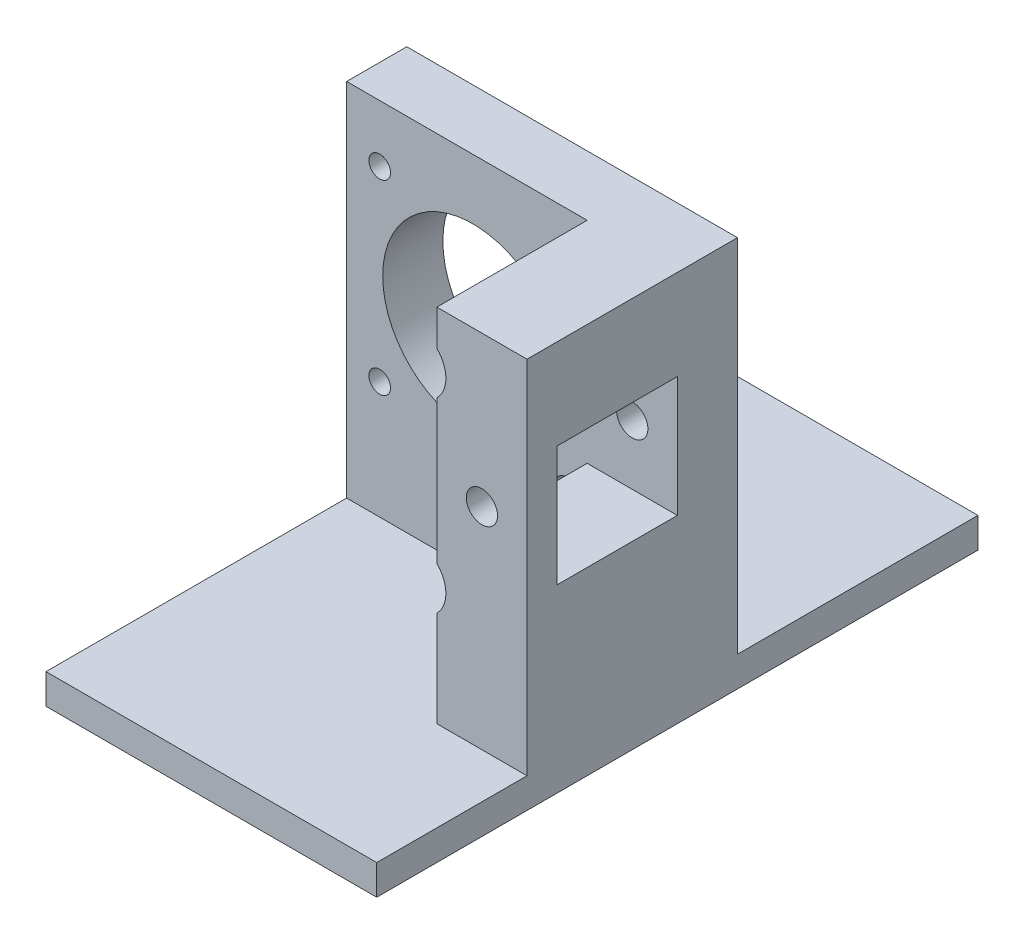
ISO-10303-21;
HEADER;
FILE_DESCRIPTION(('STEP AP214'),'2;1');
FILE_NAME('part.step','',(''),(''),'','','');
FILE_SCHEMA(('AUTOMOTIVE_DESIGN { 1 0 10303 214 1 1 1 1 }'));
ENDSEC;
DATA;
#1=APPLICATION_CONTEXT('core data for automotive mechanical design processes');
#2=APPLICATION_PROTOCOL_DEFINITION('international standard','automotive_design',2000,#1);
#3=PRODUCT_CONTEXT('',#1,'mechanical');
#4=PRODUCT('Part','Part','',(#3));
#5=PRODUCT_RELATED_PRODUCT_CATEGORY('part','',(#4));
#6=PRODUCT_DEFINITION_FORMATION('','',#4);
#7=PRODUCT_DEFINITION_CONTEXT('part definition',#1,'design');
#8=PRODUCT_DEFINITION('design','',#6,#7);
#9=PRODUCT_DEFINITION_SHAPE('','',#8);
#10=(LENGTH_UNIT() NAMED_UNIT(*) SI_UNIT(.MILLI.,.METRE.));
#11=(NAMED_UNIT(*) PLANE_ANGLE_UNIT() SI_UNIT($,.RADIAN.));
#12=(NAMED_UNIT(*) SI_UNIT($,.STERADIAN.) SOLID_ANGLE_UNIT());
#13=UNCERTAINTY_MEASURE_WITH_UNIT(LENGTH_MEASURE(1.E-05),#10,'distance_accuracy_value','');
#14=(GEOMETRIC_REPRESENTATION_CONTEXT(3) GLOBAL_UNCERTAINTY_ASSIGNED_CONTEXT((#13)) GLOBAL_UNIT_ASSIGNED_CONTEXT((#10,
#11,#12)) REPRESENTATION_CONTEXT('',''));
#15=CARTESIAN_POINT('',(0.,0.,0.));
#16=DIRECTION('',(0.,0.,1.));
#17=DIRECTION('',(1.,0.,0.));
#18=AXIS2_PLACEMENT_3D('',#15,#16,#17);
#19=CARTESIAN_POINT('',(30.,55.,0.));
#20=DIRECTION('',(-1.,0.,0.));
#21=DIRECTION('',(0.,0.,1.));
#22=AXIS2_PLACEMENT_3D('',#19,#20,#21);
#23=PLANE('',#22);
#24=DIRECTION('',(0.,0.,1.));
#25=VECTOR('',#24,1.);
#26=CARTESIAN_POINT('',(30.,20.9297201676013,-64.142135623731));
#27=LINE('',#26,#25);
#28=CARTESIAN_POINT('',(30.,20.9297201676013,-50.));
#29=VERTEX_POINT('',#28);
#30=CARTESIAN_POINT('',(30.,20.9297201676013,-25.));
#31=VERTEX_POINT('',#30);
#32=EDGE_CURVE('E90',#29,#31,#27,.T.);
#33=ORIENTED_EDGE('',*,*,#32,.F.);
#34=DIRECTION('',(0.,-1.,0.));
#35=VECTOR('',#34,1.);
#36=CARTESIAN_POINT('',(30.,55.,-50.));
#37=LINE('',#36,#35);
#38=CARTESIAN_POINT('',(30.,5.,-50.));
#39=VERTEX_POINT('',#38);
#40=EDGE_CURVE('E351',#29,#39,#37,.T.);
#41=ORIENTED_EDGE('',*,*,#40,.T.);
#42=DIRECTION('',(0.,0.,-1.));
#43=VECTOR('',#42,1.);
#44=CARTESIAN_POINT('',(30.,5.,0.));
#45=LINE('',#44,#43);
#46=CARTESIAN_POINT('',(30.,5.,-25.));
#47=VERTEX_POINT('',#46);
#48=EDGE_CURVE('E412',#47,#39,#45,.T.);
#49=ORIENTED_EDGE('',*,*,#48,.F.);
#50=DIRECTION('',(0.,-1.,0.));
#51=VECTOR('',#50,1.);
#52=CARTESIAN_POINT('',(30.,55.,-25.));
#53=LINE('',#52,#51);
#54=EDGE_CURVE('E407',#31,#47,#53,.T.);
#55=ORIENTED_EDGE('',*,*,#54,.F.);
#56=EDGE_LOOP('',(#33,#41,#49,#55));
#57=FACE_BOUND('',#56,.T.);
#58=ADVANCED_FACE('F73',(#57),#23,.T.);
#59=DIRECTION('',(0.,0.,1.));
#60=VECTOR('',#59,1.);
#61=CARTESIAN_POINT('',(30.,28.0707185451804,-64.142135623731));
#62=LINE('',#61,#60);
#63=CARTESIAN_POINT('',(30.,28.0707185451804,-25.));
#64=VERTEX_POINT('',#63);
#65=CARTESIAN_POINT('',(30.,28.0707185451804,-50.));
#66=VERTEX_POINT('',#65);
#67=EDGE_CURVE('E311',#64,#66,#62,.F.);
#68=ORIENTED_EDGE('',*,*,#67,.F.);
#69=CARTESIAN_POINT('',(30.,51.9292814548196,-25.));
#70=VERTEX_POINT('',#69);
#71=EDGE_CURVE('E413',#70,#64,#53,.T.);
#72=ORIENTED_EDGE('',*,*,#71,.F.);
#73=DIRECTION('',(0.,0.,1.));
#74=VECTOR('',#73,1.);
#75=CARTESIAN_POINT('',(30.,51.9292814548196,-64.142135623731));
#76=LINE('',#75,#74);
#77=CARTESIAN_POINT('',(30.,51.9292814548196,-50.));
#78=VERTEX_POINT('',#77);
#79=EDGE_CURVE('E97',#78,#70,#76,.T.);
#80=ORIENTED_EDGE('',*,*,#79,.F.);
#81=CARTESIAN_POINT('',(30.,50.,-50.));
#82=VERTEX_POINT('',#81);
#83=EDGE_CURVE('E360',#78,#82,#37,.T.);
#84=ORIENTED_EDGE('',*,*,#83,.T.);
#85=DIRECTION('',(0.,0.,-1.));
#86=VECTOR('',#85,1.);
#87=CARTESIAN_POINT('',(30.,50.,-3.07417596432748));
#88=LINE('',#87,#86);
#89=CARTESIAN_POINT('',(30.,50.,-30.));
#90=VERTEX_POINT('',#89);
#91=EDGE_CURVE('E396',#90,#82,#88,.T.);
#92=ORIENTED_EDGE('',*,*,#91,.F.);
#93=DIRECTION('',(0.,-1.,0.));
#94=VECTOR('',#93,1.);
#95=CARTESIAN_POINT('',(30.,55.,-30.));
#96=LINE('',#95,#94);
#97=CARTESIAN_POINT('',(30.,30.,-30.));
#98=VERTEX_POINT('',#97);
#99=EDGE_CURVE('E208',#90,#98,#96,.T.);
#100=ORIENTED_EDGE('',*,*,#99,.T.);
#101=DIRECTION('',(0.,0.,-1.));
#102=VECTOR('',#101,1.);
#103=CARTESIAN_POINT('',(30.,30.,-3.07417596432748));
#104=LINE('',#103,#102);
#105=CARTESIAN_POINT('',(30.,30.,-50.));
#106=VERTEX_POINT('',#105);
#107=EDGE_CURVE('E389',#98,#106,#104,.T.);
#108=ORIENTED_EDGE('',*,*,#107,.T.);
#109=EDGE_CURVE('E361',#106,#66,#37,.T.);
#110=ORIENTED_EDGE('',*,*,#109,.T.);
#111=EDGE_LOOP('',(#68,#72,#80,#84,#92,#100,#108,#110));
#112=FACE_BOUND('',#111,.T.);
#113=ADVANCED_FACE('F432',(#112),#23,.T.);
#114=CARTESIAN_POINT('',(0.,5.,0.));
#115=DIRECTION('',(0.,-1.,0.));
#116=DIRECTION('',(0.,0.,-1.));
#117=AXIS2_PLACEMENT_3D('',#114,#115,#116);
#118=PLANE('',#117);
#119=DIRECTION('',(0.,0.,-1.));
#120=VECTOR('',#119,1.);
#121=CARTESIAN_POINT('',(-10.,5.,0.));
#122=LINE('',#121,#120);
#123=CARTESIAN_POINT('',(-10.,5.,-60.));
#124=VERTEX_POINT('',#123);
#125=CARTESIAN_POINT('',(-10.,5.,-100.));
#126=VERTEX_POINT('',#125);
#127=EDGE_CURVE('E377',#124,#126,#122,.T.);
#128=ORIENTED_EDGE('',*,*,#127,.F.);
#129=DIRECTION('',(-1.,0.,0.));
#130=VECTOR('',#129,1.);
#131=CARTESIAN_POINT('',(40.,5.,-60.));
#132=LINE('',#131,#130);
#133=CARTESIAN_POINT('',(45.,5.,-60.));
#134=VERTEX_POINT('',#133);
#135=EDGE_CURVE('E289',#134,#124,#132,.T.);
#136=ORIENTED_EDGE('',*,*,#135,.F.);
#137=DIRECTION('',(0.,0.,1.));
#138=VECTOR('',#137,1.);
#139=CARTESIAN_POINT('',(45.,5.,-100.));
#140=LINE('',#139,#138);
#141=CARTESIAN_POINT('',(45.,5.,-100.));
#142=VERTEX_POINT('',#141);
#143=EDGE_CURVE('E241',#142,#134,#140,.T.);
#144=ORIENTED_EDGE('',*,*,#143,.F.);
#145=DIRECTION('',(1.,0.,0.));
#146=VECTOR('',#145,1.);
#147=CARTESIAN_POINT('',(0.,5.,-100.));
#148=LINE('',#147,#146);
#149=EDGE_CURVE('E385',#126,#142,#148,.T.);
#150=ORIENTED_EDGE('',*,*,#149,.F.);
#151=EDGE_LOOP('',(#128,#136,#144,#150));
#152=FACE_BOUND('',#151,.T.);
#153=ADVANCED_FACE('F504',(#152),#118,.F.);
#154=CARTESIAN_POINT('',(0.,55.,-50.));
#155=DIRECTION('',(0.,0.,1.));
#156=DIRECTION('',(1.,0.,0.));
#157=AXIS2_PLACEMENT_3D('',#154,#155,#156);
#158=PLANE('',#157);
#159=CARTESIAN_POINT('',(37.5,40.,-50.));
#160=DIRECTION('',(0.,0.,1.));
#161=DIRECTION('',(1.,0.,0.));
#162=AXIS2_PLACEMENT_3D('',#159,#160,#161);
#163=CIRCLE('',#162,2.6);
#164=CARTESIAN_POINT('',(40.1,40.,-50.));
#165=VERTEX_POINT('',#164);
#166=EDGE_CURVE('E223',#165,#165,#163,.T.);
#167=ORIENTED_EDGE('',*,*,#166,.F.);
#168=EDGE_LOOP('',(#167));
#169=FACE_BOUND('',#168,.T.);
#170=ORIENTED_EDGE('',*,*,#40,.F.);
#171=CARTESIAN_POINT('',(26.4997806436091,24.5002193563909,-50.));
#172=DIRECTION('',(0.,0.,1.));
#173=DIRECTION('',(1.,0.,0.));
#174=AXIS2_PLACEMENT_3D('',#171,#172,#173);
#175=CIRCLE('',#174,5.);
#176=EDGE_CURVE('E301',#66,#29,#175,.F.);
#177=ORIENTED_EDGE('',*,*,#176,.F.);
#178=ORIENTED_EDGE('',*,*,#109,.F.);
#179=DIRECTION('',(1.,0.,0.));
#180=VECTOR('',#179,1.);
#181=CARTESIAN_POINT('',(30.,30.,-50.));
#182=LINE('',#181,#180);
#183=CARTESIAN_POINT('',(45.,30.,-50.));
#184=VERTEX_POINT('',#183);
#185=EDGE_CURVE('E388',#106,#184,#182,.T.);
#186=ORIENTED_EDGE('',*,*,#185,.T.);
#187=DIRECTION('',(0.,1.,0.));
#188=VECTOR('',#187,1.);
#189=CARTESIAN_POINT('',(45.,50.,-50.));
#190=LINE('',#189,#188);
#191=CARTESIAN_POINT('',(45.,50.,-50.));
#192=VERTEX_POINT('',#191);
#193=EDGE_CURVE('E231',#184,#192,#190,.T.);
#194=ORIENTED_EDGE('',*,*,#193,.T.);
#195=DIRECTION('',(1.,0.,0.));
#196=VECTOR('',#195,1.);
#197=CARTESIAN_POINT('',(30.,50.,-50.));
#198=LINE('',#197,#196);
#199=EDGE_CURVE('E213',#82,#192,#198,.T.);
#200=ORIENTED_EDGE('',*,*,#199,.F.);
#201=ORIENTED_EDGE('',*,*,#83,.F.);
#202=CARTESIAN_POINT('',(26.4997806436091,55.4997806436091,-50.));
#203=DIRECTION('',(0.,0.,1.));
#204=DIRECTION('',(1.,0.,0.));
#205=AXIS2_PLACEMENT_3D('',#202,#203,#204);
#206=CIRCLE('',#205,5.);
#207=CARTESIAN_POINT('',(30.,59.0702798323987,-50.));
#208=VERTEX_POINT('',#207);
#209=EDGE_CURVE('E300',#208,#78,#206,.F.);
#210=ORIENTED_EDGE('',*,*,#209,.F.);
#211=CARTESIAN_POINT('',(30.,65.,-50.));
#212=VERTEX_POINT('',#211);
#213=EDGE_CURVE('E356',#212,#208,#37,.T.);
#214=ORIENTED_EDGE('',*,*,#213,.F.);
#215=DIRECTION('',(1.,0.,0.));
#216=VECTOR('',#215,1.);
#217=CARTESIAN_POINT('',(-10.,65.,-50.));
#218=LINE('',#217,#216);
#219=CARTESIAN_POINT('',(-10.,65.,-50.));
#220=VERTEX_POINT('',#219);
#221=EDGE_CURVE('E340',#220,#212,#218,.T.);
#222=ORIENTED_EDGE('',*,*,#221,.F.);
#223=DIRECTION('',(0.,-1.,0.));
#224=VECTOR('',#223,1.);
#225=CARTESIAN_POINT('',(-10.,55.,-50.));
#226=LINE('',#225,#224);
#227=CARTESIAN_POINT('',(-10.,5.,-50.));
#228=VERTEX_POINT('',#227);
#229=EDGE_CURVE('E352',#220,#228,#226,.T.);
#230=ORIENTED_EDGE('',*,*,#229,.T.);
#231=DIRECTION('',(1.,0.,0.));
#232=VECTOR('',#231,1.);
#233=CARTESIAN_POINT('',(-10.,5.,-50.));
#234=LINE('',#233,#232);
#235=EDGE_CURVE('E355',#228,#39,#234,.T.);
#236=ORIENTED_EDGE('',*,*,#235,.T.);
#237=EDGE_LOOP('',(#170,#177,#178,#186,#194,#200,#201,#210,#214,#222,#230,#236));
#238=FACE_BOUND('',#237,.T.);
#239=CARTESIAN_POINT('',(-4.49978064360913,24.5002193563909,-50.));
#240=DIRECTION('',(0.,0.,1.));
#241=DIRECTION('',(1.,0.,0.));
#242=AXIS2_PLACEMENT_3D('',#239,#240,#241);
#243=CIRCLE('',#242,1.8);
#244=CARTESIAN_POINT('',(-2.69978064360913,24.5002193563909,-50.));
#245=VERTEX_POINT('',#244);
#246=EDGE_CURVE('E326',#245,#245,#243,.T.);
#247=ORIENTED_EDGE('',*,*,#246,.F.);
#248=EDGE_LOOP('',(#247));
#249=FACE_BOUND('',#248,.T.);
#250=CARTESIAN_POINT('',(-4.49978064360913,55.4997806436091,-50.));
#251=DIRECTION('',(0.,0.,1.));
#252=DIRECTION('',(1.,0.,0.));
#253=AXIS2_PLACEMENT_3D('',#250,#251,#252);
#254=CIRCLE('',#253,1.8);
#255=CARTESIAN_POINT('',(-2.69978064360913,55.4997806436091,-50.));
#256=VERTEX_POINT('',#255);
#257=EDGE_CURVE('E317',#256,#256,#254,.T.);
#258=ORIENTED_EDGE('',*,*,#257,.F.);
#259=EDGE_LOOP('',(#258));
#260=FACE_BOUND('',#259,.T.);
#261=CARTESIAN_POINT('',(11.,40.,-50.));
#262=DIRECTION('',(0.,0.,1.));
#263=DIRECTION('',(1.,0.,0.));
#264=AXIS2_PLACEMENT_3D('',#261,#262,#263);
#265=CIRCLE('',#264,15.);
#266=CARTESIAN_POINT('',(26.,40.,-50.));
#267=VERTEX_POINT('',#266);
#268=EDGE_CURVE('E321',#267,#267,#265,.T.);
#269=ORIENTED_EDGE('',*,*,#268,.F.);
#270=EDGE_LOOP('',(#269));
#271=FACE_BOUND('',#270,.T.);
#272=CARTESIAN_POINT('',(26.4997806436091,55.4997806436091,-50.));
#273=DIRECTION('',(0.,0.,1.));
#274=DIRECTION('',(1.,0.,0.));
#275=AXIS2_PLACEMENT_3D('',#272,#273,#274);
#276=CIRCLE('',#275,1.8);
#277=CARTESIAN_POINT('',(28.2997806436091,55.4997806436091,-50.));
#278=VERTEX_POINT('',#277);
#279=EDGE_CURVE('E322',#278,#278,#276,.T.);
#280=ORIENTED_EDGE('',*,*,#279,.F.);
#281=EDGE_LOOP('',(#280));
#282=FACE_BOUND('',#281,.T.);
#283=CARTESIAN_POINT('',(26.4997806436091,24.5002193563909,-50.));
#284=DIRECTION('',(0.,0.,1.));
#285=DIRECTION('',(1.,0.,0.));
#286=AXIS2_PLACEMENT_3D('',#283,#284,#285);
#287=CIRCLE('',#286,1.8);
#288=CARTESIAN_POINT('',(28.2997806436091,24.5002193563909,-50.));
#289=VERTEX_POINT('',#288);
#290=EDGE_CURVE('E316',#289,#289,#287,.T.);
#291=ORIENTED_EDGE('',*,*,#290,.F.);
#292=EDGE_LOOP('',(#291));
#293=FACE_BOUND('',#292,.T.);
#294=ADVANCED_FACE('F481',(#169,#238,#249,#260,#271,#282,#293),#158,.T.);
#295=CARTESIAN_POINT('',(0.,55.,-30.));
#296=DIRECTION('',(0.,0.,1.));
#297=DIRECTION('',(1.,0.,0.));
#298=AXIS2_PLACEMENT_3D('',#295,#296,#297);
#299=PLANE('',#298);
#300=CARTESIAN_POINT('',(37.5,40.,-30.));
#301=DIRECTION('',(0.,0.,1.));
#302=DIRECTION('',(1.,0.,0.));
#303=AXIS2_PLACEMENT_3D('',#300,#301,#302);
#304=CIRCLE('',#303,2.6);
#305=CARTESIAN_POINT('',(40.1,40.,-30.));
#306=VERTEX_POINT('',#305);
#307=EDGE_CURVE('E819',#306,#306,#304,.T.);
#308=ORIENTED_EDGE('',*,*,#307,.T.);
#309=EDGE_LOOP('',(#308));
#310=FACE_BOUND('',#309,.T.);
#311=DIRECTION('',(1.,0.,0.));
#312=VECTOR('',#311,1.);
#313=CARTESIAN_POINT('',(30.,50.,-30.));
#314=LINE('',#313,#312);
#315=CARTESIAN_POINT('',(45.,50.,-30.));
#316=VERTEX_POINT('',#315);
#317=EDGE_CURVE('E200',#90,#316,#314,.T.);
#318=ORIENTED_EDGE('',*,*,#317,.T.);
#319=DIRECTION('',(0.,-1.,0.));
#320=VECTOR('',#319,1.);
#321=CARTESIAN_POINT('',(45.,50.,-30.));
#322=LINE('',#321,#320);
#323=CARTESIAN_POINT('',(45.,30.,-30.));
#324=VERTEX_POINT('',#323);
#325=EDGE_CURVE('E205',#316,#324,#322,.T.);
#326=ORIENTED_EDGE('',*,*,#325,.T.);
#327=DIRECTION('',(1.,0.,0.));
#328=VECTOR('',#327,1.);
#329=CARTESIAN_POINT('',(30.,30.,-30.));
#330=LINE('',#329,#328);
#331=EDGE_CURVE('E393',#98,#324,#330,.T.);
#332=ORIENTED_EDGE('',*,*,#331,.F.);
#333=ORIENTED_EDGE('',*,*,#99,.F.);
#334=EDGE_LOOP('',(#318,#326,#332,#333));
#335=FACE_BOUND('',#334,.T.);
#336=ADVANCED_FACE('F202',(#310,#335),#299,.F.);
#337=ORIENTED_EDGE('',*,*,#48,.T.);
#338=ORIENTED_EDGE('',*,*,#235,.F.);
#339=CARTESIAN_POINT('',(-10.,5.,0.));
#340=VERTEX_POINT('',#339);
#341=EDGE_CURVE('E378',#340,#228,#122,.T.);
#342=ORIENTED_EDGE('',*,*,#341,.F.);
#343=DIRECTION('',(1.,0.,0.));
#344=VECTOR('',#343,1.);
#345=CARTESIAN_POINT('',(0.,5.,0.));
#346=LINE('',#345,#344);
#347=CARTESIAN_POINT('',(45.,5.,0.));
#348=VERTEX_POINT('',#347);
#349=EDGE_CURVE('E418',#340,#348,#346,.T.);
#350=ORIENTED_EDGE('',*,*,#349,.T.);
#351=DIRECTION('',(0.,0.,1.));
#352=VECTOR('',#351,1.);
#353=CARTESIAN_POINT('',(45.,5.,-25.));
#354=LINE('',#353,#352);
#355=CARTESIAN_POINT('',(45.,5.,-25.));
#356=VERTEX_POINT('',#355);
#357=EDGE_CURVE('E257',#356,#348,#354,.T.);
#358=ORIENTED_EDGE('',*,*,#357,.F.);
#359=DIRECTION('',(1.,0.,0.));
#360=VECTOR('',#359,1.);
#361=CARTESIAN_POINT('',(0.,5.,-25.));
#362=LINE('',#361,#360);
#363=EDGE_CURVE('E212',#47,#356,#362,.T.);
#364=ORIENTED_EDGE('',*,*,#363,.F.);
#365=EDGE_LOOP('',(#337,#338,#342,#350,#358,#364));
#366=FACE_BOUND('',#365,.T.);
#367=ADVANCED_FACE('F446',(#366),#118,.F.);
#368=CARTESIAN_POINT('',(0.,5.,0.));
#369=DIRECTION('',(0.,0.,-1.));
#370=DIRECTION('',(-1.,0.,0.));
#371=AXIS2_PLACEMENT_3D('',#368,#369,#370);
#372=PLANE('',#371);
#373=DIRECTION('',(1.,0.,0.));
#374=VECTOR('',#373,1.);
#375=CARTESIAN_POINT('',(0.,0.,0.));
#376=LINE('',#375,#374);
#377=CARTESIAN_POINT('',(-10.,0.,0.));
#378=VERTEX_POINT('',#377);
#379=CARTESIAN_POINT('',(45.,0.,0.));
#380=VERTEX_POINT('',#379);
#381=EDGE_CURVE('E417',#378,#380,#376,.T.);
#382=ORIENTED_EDGE('',*,*,#381,.T.);
#383=DIRECTION('',(0.,-1.,0.));
#384=VECTOR('',#383,1.);
#385=CARTESIAN_POINT('',(45.,5.,0.));
#386=LINE('',#385,#384);
#387=EDGE_CURVE('E261',#348,#380,#386,.T.);
#388=ORIENTED_EDGE('',*,*,#387,.F.);
#389=ORIENTED_EDGE('',*,*,#349,.F.);
#390=DIRECTION('',(0.,1.,0.));
#391=VECTOR('',#390,1.);
#392=CARTESIAN_POINT('',(-10.,0.,0.));
#393=LINE('',#392,#391);
#394=EDGE_CURVE('E373',#378,#340,#393,.T.);
#395=ORIENTED_EDGE('',*,*,#394,.F.);
#396=EDGE_LOOP('',(#382,#388,#389,#395));
#397=FACE_BOUND('',#396,.T.);
#398=ADVANCED_FACE('F75',(#397),#372,.F.);
#399=CARTESIAN_POINT('',(0.,0.,0.));
#400=DIRECTION('',(0.,-1.,0.));
#401=DIRECTION('',(0.,0.,-1.));
#402=AXIS2_PLACEMENT_3D('',#399,#400,#401);
#403=PLANE('',#402);
#404=ORIENTED_EDGE('',*,*,#381,.F.);
#405=DIRECTION('',(0.,0.,1.));
#406=VECTOR('',#405,1.);
#407=CARTESIAN_POINT('',(-10.,0.,-100.));
#408=LINE('',#407,#406);
#409=CARTESIAN_POINT('',(-10.,0.,-100.));
#410=VERTEX_POINT('',#409);
#411=EDGE_CURVE('E369',#410,#378,#408,.T.);
#412=ORIENTED_EDGE('',*,*,#411,.F.);
#413=DIRECTION('',(-1.,0.,0.));
#414=VECTOR('',#413,1.);
#415=CARTESIAN_POINT('',(40.,0.,-100.));
#416=LINE('',#415,#414);
#417=CARTESIAN_POINT('',(45.,0.,-100.));
#418=VERTEX_POINT('',#417);
#419=EDGE_CURVE('E382',#418,#410,#416,.T.);
#420=ORIENTED_EDGE('',*,*,#419,.F.);
#421=DIRECTION('',(0.,0.,-1.));
#422=VECTOR('',#421,1.);
#423=CARTESIAN_POINT('',(45.,0.,0.));
#424=LINE('',#423,#422);
#425=EDGE_CURVE('E265',#380,#418,#424,.T.);
#426=ORIENTED_EDGE('',*,*,#425,.F.);
#427=EDGE_LOOP('',(#404,#412,#420,#426));
#428=FACE_BOUND('',#427,.T.);
#429=ADVANCED_FACE('F455',(#428),#403,.T.);
#430=DIRECTION('',(0.,0.,1.));
#431=VECTOR('',#430,1.);
#432=CARTESIAN_POINT('',(30.,59.0702798323987,-64.142135623731));
#433=LINE('',#432,#431);
#434=CARTESIAN_POINT('',(30.,59.0702798323987,-25.));
#435=VERTEX_POINT('',#434);
#436=EDGE_CURVE('E304',#435,#208,#433,.F.);
#437=ORIENTED_EDGE('',*,*,#436,.F.);
#438=CARTESIAN_POINT('',(30.,65.,-25.));
#439=VERTEX_POINT('',#438);
#440=EDGE_CURVE('E408',#439,#435,#53,.T.);
#441=ORIENTED_EDGE('',*,*,#440,.F.);
#442=DIRECTION('',(0.,0.,1.));
#443=VECTOR('',#442,1.);
#444=CARTESIAN_POINT('',(30.,65.,-50.));
#445=LINE('',#444,#443);
#446=EDGE_CURVE('E344',#212,#439,#445,.T.);
#447=ORIENTED_EDGE('',*,*,#446,.F.);
#448=ORIENTED_EDGE('',*,*,#213,.T.);
#449=EDGE_LOOP('',(#437,#441,#447,#448));
#450=FACE_BOUND('',#449,.T.);
#451=ADVANCED_FACE('F477',(#450),#23,.T.);
#452=CARTESIAN_POINT('',(0.,55.,-25.));
#453=DIRECTION('',(0.,0.,-1.));
#454=DIRECTION('',(-1.,0.,0.));
#455=AXIS2_PLACEMENT_3D('',#452,#453,#454);
#456=PLANE('',#455);
#457=CARTESIAN_POINT('',(37.5,40.,-25.));
#458=DIRECTION('',(0.,0.,-1.));
#459=DIRECTION('',(-1.,0.,0.));
#460=AXIS2_PLACEMENT_3D('',#457,#458,#459);
#461=CIRCLE('',#460,2.6);
#462=CARTESIAN_POINT('',(34.9,40.,-25.));
#463=VERTEX_POINT('',#462);
#464=EDGE_CURVE('E816',#463,#463,#461,.T.);
#465=ORIENTED_EDGE('',*,*,#464,.T.);
#466=EDGE_LOOP('',(#465));
#467=FACE_BOUND('',#466,.T.);
#468=ORIENTED_EDGE('',*,*,#71,.T.);
#469=CARTESIAN_POINT('',(26.4997806436091,24.5002193563909,-25.));
#470=DIRECTION('',(0.,0.,-1.));
#471=DIRECTION('',(-1.,0.,0.));
#472=AXIS2_PLACEMENT_3D('',#469,#470,#471);
#473=CIRCLE('',#472,5.);
#474=EDGE_CURVE('E12',#64,#31,#473,.T.);
#475=ORIENTED_EDGE('',*,*,#474,.T.);
#476=ORIENTED_EDGE('',*,*,#54,.T.);
#477=ORIENTED_EDGE('',*,*,#363,.T.);
#478=DIRECTION('',(0.,-1.,0.));
#479=VECTOR('',#478,1.);
#480=CARTESIAN_POINT('',(45.,65.,-25.));
#481=LINE('',#480,#479);
#482=CARTESIAN_POINT('',(45.,65.,-25.));
#483=VERTEX_POINT('',#482);
#484=EDGE_CURVE('E253',#483,#356,#481,.T.);
#485=ORIENTED_EDGE('',*,*,#484,.F.);
#486=DIRECTION('',(1.,0.,0.));
#487=VECTOR('',#486,1.);
#488=CARTESIAN_POINT('',(30.,65.,-25.));
#489=LINE('',#488,#487);
#490=EDGE_CURVE('E348',#439,#483,#489,.T.);
#491=ORIENTED_EDGE('',*,*,#490,.F.);
#492=ORIENTED_EDGE('',*,*,#440,.T.);
#493=CARTESIAN_POINT('',(26.4997806436091,55.4997806436091,-25.));
#494=DIRECTION('',(0.,0.,-1.));
#495=DIRECTION('',(-1.,0.,0.));
#496=AXIS2_PLACEMENT_3D('',#493,#494,#495);
#497=CIRCLE('',#496,5.);
#498=EDGE_CURVE('E83',#435,#70,#497,.T.);
#499=ORIENTED_EDGE('',*,*,#498,.T.);
#500=EDGE_LOOP('',(#468,#475,#476,#477,#485,#491,#492,#499));
#501=FACE_BOUND('',#500,.T.);
#502=ADVANCED_FACE('F427',(#467,#501),#456,.F.);
#503=CARTESIAN_POINT('',(30.,50.,-3.07417596432748));
#504=DIRECTION('',(0.,1.,0.));
#505=DIRECTION('',(0.,0.,1.));
#506=AXIS2_PLACEMENT_3D('',#503,#504,#505);
#507=PLANE('',#506);
#508=ORIENTED_EDGE('',*,*,#317,.F.);
#509=ORIENTED_EDGE('',*,*,#91,.T.);
#510=ORIENTED_EDGE('',*,*,#199,.T.);
#511=DIRECTION('',(0.,0.,1.));
#512=VECTOR('',#511,1.);
#513=CARTESIAN_POINT('',(45.,50.,-30.));
#514=LINE('',#513,#512);
#515=EDGE_CURVE('E216',#192,#316,#514,.T.);
#516=ORIENTED_EDGE('',*,*,#515,.T.);
#517=EDGE_LOOP('',(#508,#509,#510,#516));
#518=FACE_BOUND('',#517,.T.);
#519=ADVANCED_FACE('F217',(#518),#507,.F.);
#520=CARTESIAN_POINT('',(30.,30.,-3.07417596432748));
#521=DIRECTION('',(0.,1.,0.));
#522=DIRECTION('',(0.,0.,1.));
#523=AXIS2_PLACEMENT_3D('',#520,#521,#522);
#524=PLANE('',#523);
#525=ORIENTED_EDGE('',*,*,#107,.F.);
#526=ORIENTED_EDGE('',*,*,#331,.T.);
#527=DIRECTION('',(0.,0.,-1.));
#528=VECTOR('',#527,1.);
#529=CARTESIAN_POINT('',(45.,30.,-30.));
#530=LINE('',#529,#528);
#531=EDGE_CURVE('E227',#324,#184,#530,.T.);
#532=ORIENTED_EDGE('',*,*,#531,.T.);
#533=ORIENTED_EDGE('',*,*,#185,.F.);
#534=EDGE_LOOP('',(#525,#526,#532,#533));
#535=FACE_BOUND('',#534,.T.);
#536=ADVANCED_FACE('F536',(#535),#524,.T.);
#537=CARTESIAN_POINT('',(0.,0.,-100.));
#538=DIRECTION('',(0.,0.,-1.));
#539=DIRECTION('',(-1.,0.,0.));
#540=AXIS2_PLACEMENT_3D('',#537,#538,#539);
#541=PLANE('',#540);
#542=ORIENTED_EDGE('',*,*,#149,.T.);
#543=DIRECTION('',(0.,1.,0.));
#544=VECTOR('',#543,1.);
#545=CARTESIAN_POINT('',(45.,0.,-100.));
#546=LINE('',#545,#544);
#547=EDGE_CURVE('E237',#418,#142,#546,.T.);
#548=ORIENTED_EDGE('',*,*,#547,.F.);
#549=ORIENTED_EDGE('',*,*,#419,.T.);
#550=DIRECTION('',(0.,-1.,0.));
#551=VECTOR('',#550,1.);
#552=CARTESIAN_POINT('',(-10.,5.,-100.));
#553=LINE('',#552,#551);
#554=EDGE_CURVE('E365',#126,#410,#553,.T.);
#555=ORIENTED_EDGE('',*,*,#554,.F.);
#556=EDGE_LOOP('',(#542,#548,#549,#555));
#557=FACE_BOUND('',#556,.T.);
#558=ADVANCED_FACE('F462',(#557),#541,.T.);
#559=CARTESIAN_POINT('',(-10.,0.,0.));
#560=DIRECTION('',(-1.,0.,0.));
#561=DIRECTION('',(0.,0.,1.));
#562=AXIS2_PLACEMENT_3D('',#559,#560,#561);
#563=PLANE('',#562);
#564=ORIENTED_EDGE('',*,*,#554,.T.);
#565=ORIENTED_EDGE('',*,*,#411,.T.);
#566=ORIENTED_EDGE('',*,*,#394,.T.);
#567=ORIENTED_EDGE('',*,*,#341,.T.);
#568=ORIENTED_EDGE('',*,*,#229,.F.);
#569=DIRECTION('',(0.,0.,1.));
#570=VECTOR('',#569,1.);
#571=CARTESIAN_POINT('',(-10.,65.,-55.));
#572=LINE('',#571,#570);
#573=CARTESIAN_POINT('',(-10.,65.,-60.));
#574=VERTEX_POINT('',#573);
#575=EDGE_CURVE('E336',#574,#220,#572,.T.);
#576=ORIENTED_EDGE('',*,*,#575,.F.);
#577=DIRECTION('',(0.,1.,0.));
#578=VECTOR('',#577,1.);
#579=CARTESIAN_POINT('',(-10.,5.,-60.));
#580=LINE('',#579,#578);
#581=EDGE_CURVE('E293',#124,#574,#580,.T.);
#582=ORIENTED_EDGE('',*,*,#581,.F.);
#583=ORIENTED_EDGE('',*,*,#127,.T.);
#584=EDGE_LOOP('',(#564,#565,#566,#567,#568,#576,#582,#583));
#585=FACE_BOUND('',#584,.T.);
#586=ADVANCED_FACE('F457',(#585),#563,.T.);
#587=CARTESIAN_POINT('',(0.,65.,0.));
#588=DIRECTION('',(0.,1.,0.));
#589=DIRECTION('',(0.,0.,1.));
#590=AXIS2_PLACEMENT_3D('',#587,#588,#589);
#591=PLANE('',#590);
#592=ORIENTED_EDGE('',*,*,#490,.T.);
#593=DIRECTION('',(0.,0.,1.));
#594=VECTOR('',#593,1.);
#595=CARTESIAN_POINT('',(45.,65.,-60.));
#596=LINE('',#595,#594);
#597=CARTESIAN_POINT('',(45.,65.,-60.));
#598=VERTEX_POINT('',#597);
#599=EDGE_CURVE('E249',#598,#483,#596,.T.);
#600=ORIENTED_EDGE('',*,*,#599,.F.);
#601=DIRECTION('',(1.,0.,0.));
#602=VECTOR('',#601,1.);
#603=CARTESIAN_POINT('',(-10.,65.,-60.));
#604=LINE('',#603,#602);
#605=EDGE_CURVE('E297',#574,#598,#604,.T.);
#606=ORIENTED_EDGE('',*,*,#605,.F.);
#607=ORIENTED_EDGE('',*,*,#575,.T.);
#608=ORIENTED_EDGE('',*,*,#221,.T.);
#609=ORIENTED_EDGE('',*,*,#446,.T.);
#610=EDGE_LOOP('',(#592,#600,#606,#607,#608,#609));
#611=FACE_BOUND('',#610,.T.);
#612=ADVANCED_FACE('F473',(#611),#591,.T.);
#613=CARTESIAN_POINT('',(11.,40.,-97.4264068711929));
#614=DIRECTION('',(0.,0.,1.));
#615=DIRECTION('',(1.,0.,0.));
#616=AXIS2_PLACEMENT_3D('',#613,#614,#615);
#617=CYLINDRICAL_SURFACE('',#616,15.);
#618=ORIENTED_EDGE('',*,*,#268,.T.);
#619=EDGE_LOOP('',(#618));
#620=FACE_BOUND('',#619,.T.);
#621=CARTESIAN_POINT('',(11.,40.,-60.));
#622=DIRECTION('',(0.,0.,-1.));
#623=DIRECTION('',(-1.,0.,0.));
#624=AXIS2_PLACEMENT_3D('',#621,#622,#623);
#625=CIRCLE('',#624,15.);
#626=CARTESIAN_POINT('',(-4.,40.,-60.));
#627=VERTEX_POINT('',#626);
#628=EDGE_CURVE('E273',#627,#627,#625,.T.);
#629=ORIENTED_EDGE('',*,*,#628,.T.);
#630=EDGE_LOOP('',(#629));
#631=FACE_BOUND('',#630,.T.);
#632=ADVANCED_FACE('F546',(#620,#631),#617,.F.);
#633=CARTESIAN_POINT('',(-4.49978064360913,55.4997806436091,-97.4264068711929));
#634=DIRECTION('',(0.,0.,1.));
#635=DIRECTION('',(1.,0.,0.));
#636=AXIS2_PLACEMENT_3D('',#633,#634,#635);
#637=CYLINDRICAL_SURFACE('',#636,1.8);
#638=ORIENTED_EDGE('',*,*,#257,.T.);
#639=EDGE_LOOP('',(#638));
#640=FACE_BOUND('',#639,.T.);
#641=CARTESIAN_POINT('',(-4.49978064360913,55.4997806436091,-60.));
#642=DIRECTION('',(0.,0.,-1.));
#643=DIRECTION('',(-1.,0.,0.));
#644=AXIS2_PLACEMENT_3D('',#641,#642,#643);
#645=CIRCLE('',#644,1.8);
#646=CARTESIAN_POINT('',(-6.29978064360913,55.4997806436091,-60.));
#647=VERTEX_POINT('',#646);
#648=EDGE_CURVE('E285',#647,#647,#645,.T.);
#649=ORIENTED_EDGE('',*,*,#648,.T.);
#650=EDGE_LOOP('',(#649));
#651=FACE_BOUND('',#650,.T.);
#652=ADVANCED_FACE('F549',(#640,#651),#637,.F.);
#653=CARTESIAN_POINT('',(26.4997806436091,55.4997806436091,-97.4264068711929));
#654=DIRECTION('',(0.,0.,1.));
#655=DIRECTION('',(1.,0.,0.));
#656=AXIS2_PLACEMENT_3D('',#653,#654,#655);
#657=CYLINDRICAL_SURFACE('',#656,1.8);
#658=ORIENTED_EDGE('',*,*,#279,.T.);
#659=EDGE_LOOP('',(#658));
#660=FACE_BOUND('',#659,.T.);
#661=CARTESIAN_POINT('',(26.4997806436091,55.4997806436091,-60.));
#662=DIRECTION('',(0.,0.,-1.));
#663=DIRECTION('',(-1.,0.,0.));
#664=AXIS2_PLACEMENT_3D('',#661,#662,#663);
#665=CIRCLE('',#664,1.8);
#666=CARTESIAN_POINT('',(24.6997806436091,55.4997806436091,-60.));
#667=VERTEX_POINT('',#666);
#668=EDGE_CURVE('E269',#667,#667,#665,.T.);
#669=ORIENTED_EDGE('',*,*,#668,.T.);
#670=EDGE_LOOP('',(#669));
#671=FACE_BOUND('',#670,.T.);
#672=ADVANCED_FACE('F557',(#660,#671),#657,.F.);
#673=CARTESIAN_POINT('',(-4.49978064360913,24.5002193563909,-97.4264068711929));
#674=DIRECTION('',(0.,0.,1.));
#675=DIRECTION('',(1.,0.,0.));
#676=AXIS2_PLACEMENT_3D('',#673,#674,#675);
#677=CYLINDRICAL_SURFACE('',#676,1.8);
#678=ORIENTED_EDGE('',*,*,#246,.T.);
#679=EDGE_LOOP('',(#678));
#680=FACE_BOUND('',#679,.T.);
#681=CARTESIAN_POINT('',(-4.49978064360913,24.5002193563909,-60.));
#682=DIRECTION('',(0.,0.,-1.));
#683=DIRECTION('',(-1.,0.,0.));
#684=AXIS2_PLACEMENT_3D('',#681,#682,#683);
#685=CIRCLE('',#684,1.8);
#686=CARTESIAN_POINT('',(-6.29978064360913,24.5002193563909,-60.));
#687=VERTEX_POINT('',#686);
#688=EDGE_CURVE('E281',#687,#687,#685,.T.);
#689=ORIENTED_EDGE('',*,*,#688,.T.);
#690=EDGE_LOOP('',(#689));
#691=FACE_BOUND('',#690,.T.);
#692=ADVANCED_FACE('F553',(#680,#691),#677,.F.);
#693=CARTESIAN_POINT('',(26.4997806436091,24.5002193563909,-97.4264068711929));
#694=DIRECTION('',(0.,0.,1.));
#695=DIRECTION('',(1.,0.,0.));
#696=AXIS2_PLACEMENT_3D('',#693,#694,#695);
#697=CYLINDRICAL_SURFACE('',#696,1.8);
#698=ORIENTED_EDGE('',*,*,#290,.T.);
#699=EDGE_LOOP('',(#698));
#700=FACE_BOUND('',#699,.T.);
#701=CARTESIAN_POINT('',(26.4997806436091,24.5002193563909,-60.));
#702=DIRECTION('',(0.,0.,-1.));
#703=DIRECTION('',(-1.,0.,0.));
#704=AXIS2_PLACEMENT_3D('',#701,#702,#703);
#705=CIRCLE('',#704,1.8);
#706=CARTESIAN_POINT('',(24.6997806436091,24.5002193563909,-60.));
#707=VERTEX_POINT('',#706);
#708=EDGE_CURVE('E277',#707,#707,#705,.T.);
#709=ORIENTED_EDGE('',*,*,#708,.T.);
#710=EDGE_LOOP('',(#709));
#711=FACE_BOUND('',#710,.T.);
#712=ADVANCED_FACE('F497',(#700,#711),#697,.F.);
#713=CARTESIAN_POINT('',(26.4997806436091,55.4997806436091,-64.142135623731));
#714=DIRECTION('',(0.,0.,1.));
#715=DIRECTION('',(1.,0.,0.));
#716=AXIS2_PLACEMENT_3D('',#713,#714,#715);
#717=CYLINDRICAL_SURFACE('',#716,5.);
#718=ORIENTED_EDGE('',*,*,#79,.T.);
#719=ORIENTED_EDGE('',*,*,#498,.F.);
#720=ORIENTED_EDGE('',*,*,#436,.T.);
#721=ORIENTED_EDGE('',*,*,#209,.T.);
#722=EDGE_LOOP('',(#718,#719,#720,#721));
#723=FACE_BOUND('',#722,.T.);
#724=ADVANCED_FACE('F479',(#723),#717,.F.);
#725=CARTESIAN_POINT('',(26.4997806436091,24.5002193563909,-64.142135623731));
#726=DIRECTION('',(0.,0.,1.));
#727=DIRECTION('',(1.,0.,0.));
#728=AXIS2_PLACEMENT_3D('',#725,#726,#727);
#729=CYLINDRICAL_SURFACE('',#728,5.);
#730=ORIENTED_EDGE('',*,*,#32,.T.);
#731=ORIENTED_EDGE('',*,*,#474,.F.);
#732=ORIENTED_EDGE('',*,*,#67,.T.);
#733=ORIENTED_EDGE('',*,*,#176,.T.);
#734=EDGE_LOOP('',(#730,#731,#732,#733));
#735=FACE_BOUND('',#734,.T.);
#736=ADVANCED_FACE('F488',(#735),#729,.F.);
#737=CARTESIAN_POINT('',(0.,0.,-60.));
#738=DIRECTION('',(0.,0.,-1.));
#739=DIRECTION('',(-1.,0.,0.));
#740=AXIS2_PLACEMENT_3D('',#737,#738,#739);
#741=PLANE('',#740);
#742=CARTESIAN_POINT('',(37.5,40.,-60.));
#743=DIRECTION('',(0.,0.,-1.));
#744=DIRECTION('',(-1.,0.,0.));
#745=AXIS2_PLACEMENT_3D('',#742,#743,#744);
#746=CIRCLE('',#745,2.6);
#747=CARTESIAN_POINT('',(34.9,40.,-60.));
#748=VERTEX_POINT('',#747);
#749=EDGE_CURVE('E77',#748,#748,#746,.T.);
#750=ORIENTED_EDGE('',*,*,#749,.F.);
#751=EDGE_LOOP('',(#750));
#752=FACE_BOUND('',#751,.T.);
#753=ORIENTED_EDGE('',*,*,#708,.F.);
#754=EDGE_LOOP('',(#753));
#755=FACE_BOUND('',#754,.T.);
#756=ORIENTED_EDGE('',*,*,#648,.F.);
#757=EDGE_LOOP('',(#756));
#758=FACE_BOUND('',#757,.T.);
#759=ORIENTED_EDGE('',*,*,#135,.T.);
#760=ORIENTED_EDGE('',*,*,#581,.T.);
#761=ORIENTED_EDGE('',*,*,#605,.T.);
#762=DIRECTION('',(0.,1.,0.));
#763=VECTOR('',#762,1.);
#764=CARTESIAN_POINT('',(45.,5.,-60.));
#765=LINE('',#764,#763);
#766=EDGE_CURVE('E245',#134,#598,#765,.T.);
#767=ORIENTED_EDGE('',*,*,#766,.F.);
#768=EDGE_LOOP('',(#759,#760,#761,#767));
#769=FACE_BOUND('',#768,.T.);
#770=ORIENTED_EDGE('',*,*,#688,.F.);
#771=EDGE_LOOP('',(#770));
#772=FACE_BOUND('',#771,.T.);
#773=ORIENTED_EDGE('',*,*,#628,.F.);
#774=EDGE_LOOP('',(#773));
#775=FACE_BOUND('',#774,.T.);
#776=ORIENTED_EDGE('',*,*,#668,.F.);
#777=EDGE_LOOP('',(#776));
#778=FACE_BOUND('',#777,.T.);
#779=ADVANCED_FACE('F469',(#752,#755,#758,#769,#772,#775,#778),#741,.T.);
#780=CARTESIAN_POINT('',(45.,0.,0.));
#781=DIRECTION('',(1.,0.,0.));
#782=DIRECTION('',(0.,0.,-1.));
#783=AXIS2_PLACEMENT_3D('',#780,#781,#782);
#784=PLANE('',#783);
#785=ORIENTED_EDGE('',*,*,#547,.T.);
#786=ORIENTED_EDGE('',*,*,#143,.T.);
#787=ORIENTED_EDGE('',*,*,#766,.T.);
#788=ORIENTED_EDGE('',*,*,#599,.T.);
#789=ORIENTED_EDGE('',*,*,#484,.T.);
#790=ORIENTED_EDGE('',*,*,#357,.T.);
#791=ORIENTED_EDGE('',*,*,#387,.T.);
#792=ORIENTED_EDGE('',*,*,#425,.T.);
#793=EDGE_LOOP('',(#785,#786,#787,#788,#789,#790,#791,#792));
#794=FACE_BOUND('',#793,.T.);
#795=ORIENTED_EDGE('',*,*,#325,.F.);
#796=ORIENTED_EDGE('',*,*,#515,.F.);
#797=ORIENTED_EDGE('',*,*,#193,.F.);
#798=ORIENTED_EDGE('',*,*,#531,.F.);
#799=EDGE_LOOP('',(#795,#796,#797,#798));
#800=FACE_BOUND('',#799,.T.);
#801=ADVANCED_FACE('F225',(#794,#800),#784,.T.);
#802=CARTESIAN_POINT('',(37.5,40.,0.));
#803=DIRECTION('',(0.,0.,-1.));
#804=DIRECTION('',(-1.,0.,0.));
#805=AXIS2_PLACEMENT_3D('',#802,#803,#804);
#806=CYLINDRICAL_SURFACE('',#805,2.6);
#807=ORIENTED_EDGE('',*,*,#166,.T.);
#808=EDGE_LOOP('',(#807));
#809=FACE_BOUND('',#808,.T.);
#810=ORIENTED_EDGE('',*,*,#749,.T.);
#811=EDGE_LOOP('',(#810));
#812=FACE_BOUND('',#811,.T.);
#813=ADVANCED_FACE('F776',(#809,#812),#806,.F.);
#814=ORIENTED_EDGE('',*,*,#464,.F.);
#815=EDGE_LOOP('',(#814));
#816=FACE_BOUND('',#815,.T.);
#817=ORIENTED_EDGE('',*,*,#307,.F.);
#818=EDGE_LOOP('',(#817));
#819=FACE_BOUND('',#818,.T.);
#820=ADVANCED_FACE('F795',(#816,#819),#806,.F.);
#821=CLOSED_SHELL('',(#58,#113,#153,#294,#336,#367,#398,#429,#451,#502,#519,#536,#558,#586,#612,
#632,#652,#672,#692,#712,#724,#736,#779,#801,#813,#820));
#822=MANIFOLD_SOLID_BREP('B2',#821);
#823=ADVANCED_BREP_SHAPE_REPRESENTATION('',(#18,#822),#14);
#824=SHAPE_DEFINITION_REPRESENTATION(#9,#823);
ENDSEC;
END-ISO-10303-21;
